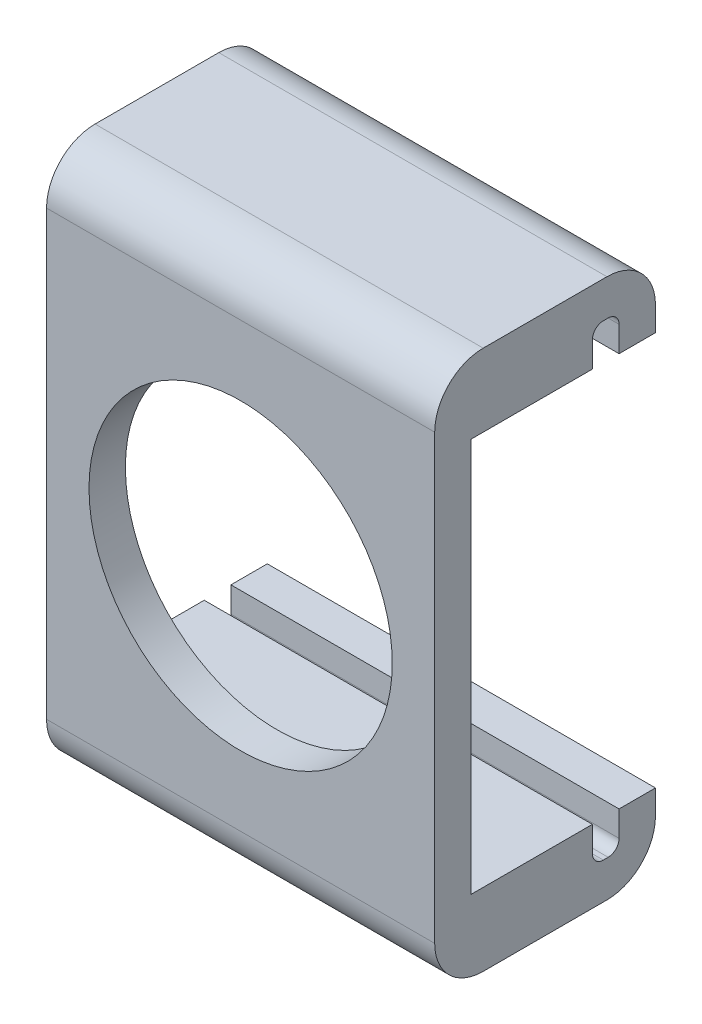
ISO-10303-21;
HEADER;
FILE_DESCRIPTION(('STEP AP214'),'2;1');
FILE_NAME('part.step','',(''),(''),'','','');
FILE_SCHEMA(('AUTOMOTIVE_DESIGN { 1 0 10303 214 1 1 1 1 }'));
ENDSEC;
DATA;
#1=APPLICATION_CONTEXT('core data for automotive mechanical design processes');
#2=APPLICATION_PROTOCOL_DEFINITION('international standard','automotive_design',2000,#1);
#3=PRODUCT_CONTEXT('',#1,'mechanical');
#4=PRODUCT('Part','Part','',(#3));
#5=PRODUCT_RELATED_PRODUCT_CATEGORY('part','',(#4));
#6=PRODUCT_DEFINITION_FORMATION('','',#4);
#7=PRODUCT_DEFINITION_CONTEXT('part definition',#1,'design');
#8=PRODUCT_DEFINITION('design','',#6,#7);
#9=PRODUCT_DEFINITION_SHAPE('','',#8);
#10=(LENGTH_UNIT() NAMED_UNIT(*) SI_UNIT(.MILLI.,.METRE.));
#11=(NAMED_UNIT(*) PLANE_ANGLE_UNIT() SI_UNIT($,.RADIAN.));
#12=(NAMED_UNIT(*) SI_UNIT($,.STERADIAN.) SOLID_ANGLE_UNIT());
#13=UNCERTAINTY_MEASURE_WITH_UNIT(LENGTH_MEASURE(1.E-05),#10,'distance_accuracy_value','');
#14=(GEOMETRIC_REPRESENTATION_CONTEXT(3) GLOBAL_UNCERTAINTY_ASSIGNED_CONTEXT((#13)) GLOBAL_UNIT_ASSIGNED_CONTEXT((#10,
#11,#12)) REPRESENTATION_CONTEXT('',''));
#15=CARTESIAN_POINT('',(0.,0.,0.));
#16=DIRECTION('',(0.,0.,1.));
#17=DIRECTION('',(1.,0.,0.));
#18=AXIS2_PLACEMENT_3D('',#15,#16,#17);
#19=CARTESIAN_POINT('',(0.,0.,3.));
#20=DIRECTION('',(1.,0.,0.));
#21=DIRECTION('',(0.,0.,-1.));
#22=AXIS2_PLACEMENT_3D('',#19,#20,#21);
#23=PLANE('',#22);
#24=DIRECTION('',(0.,1.,0.));
#25=VECTOR('',#24,1.);
#26=CARTESIAN_POINT('',(0.,0.,-15.2));
#27=LINE('',#26,#25);
#28=CARTESIAN_POINT('',(0.,4.,-15.2));
#29=VERTEX_POINT('',#28);
#30=CARTESIAN_POINT('',(0.,5.99999999999999,-15.2));
#31=VERTEX_POINT('',#30);
#32=EDGE_CURVE('E197',#29,#31,#27,.T.);
#33=ORIENTED_EDGE('',*,*,#32,.F.);
#34=CARTESIAN_POINT('',(0.,4.,-11.2));
#35=DIRECTION('',(1.,0.,0.));
#36=DIRECTION('',(0.,0.,-1.));
#37=AXIS2_PLACEMENT_3D('',#34,#35,#36);
#38=CIRCLE('',#37,4.);
#39=CARTESIAN_POINT('',(0.,0.,-11.2));
#40=VERTEX_POINT('',#39);
#41=EDGE_CURVE('E383',#29,#40,#38,.F.);
#42=ORIENTED_EDGE('',*,*,#41,.T.);
#43=DIRECTION('',(0.,0.,-1.));
#44=VECTOR('',#43,1.);
#45=CARTESIAN_POINT('',(0.,0.,3.));
#46=LINE('',#45,#44);
#47=CARTESIAN_POINT('',(0.,0.,-1.));
#48=VERTEX_POINT('',#47);
#49=EDGE_CURVE('E348',#48,#40,#46,.T.);
#50=ORIENTED_EDGE('',*,*,#49,.F.);
#51=CARTESIAN_POINT('',(0.,4.,-1.));
#52=DIRECTION('',(1.,0.,0.));
#53=DIRECTION('',(0.,0.,-1.));
#54=AXIS2_PLACEMENT_3D('',#51,#52,#53);
#55=CIRCLE('',#54,4.);
#56=CARTESIAN_POINT('',(0.,4.,3.));
#57=VERTEX_POINT('',#56);
#58=EDGE_CURVE('E370',#48,#57,#55,.F.);
#59=ORIENTED_EDGE('',*,*,#58,.T.);
#60=DIRECTION('',(0.,-1.,0.));
#61=VECTOR('',#60,1.);
#62=CARTESIAN_POINT('',(0.,0.,3.));
#63=LINE('',#62,#61);
#64=CARTESIAN_POINT('',(0.,40.5,3.));
#65=VERTEX_POINT('',#64);
#66=EDGE_CURVE('E331',#65,#57,#63,.T.);
#67=ORIENTED_EDGE('',*,*,#66,.F.);
#68=CARTESIAN_POINT('',(0.,40.5,-1.));
#69=DIRECTION('',(1.,0.,0.));
#70=DIRECTION('',(0.,0.,-1.));
#71=AXIS2_PLACEMENT_3D('',#68,#69,#70);
#72=CIRCLE('',#71,4.);
#73=CARTESIAN_POINT('',(0.,44.5,-1.));
#74=VERTEX_POINT('',#73);
#75=EDGE_CURVE('E368',#65,#74,#72,.F.);
#76=ORIENTED_EDGE('',*,*,#75,.T.);
#77=DIRECTION('',(0.,0.,-1.));
#78=VECTOR('',#77,1.);
#79=CARTESIAN_POINT('',(0.,44.5,3.));
#80=LINE('',#79,#78);
#81=CARTESIAN_POINT('',(0.,44.5,-11.2));
#82=VERTEX_POINT('',#81);
#83=EDGE_CURVE('E338',#74,#82,#80,.T.);
#84=ORIENTED_EDGE('',*,*,#83,.T.);
#85=CARTESIAN_POINT('',(0.,40.5,-11.2));
#86=DIRECTION('',(1.,0.,0.));
#87=DIRECTION('',(0.,0.,-1.));
#88=AXIS2_PLACEMENT_3D('',#85,#86,#87);
#89=CIRCLE('',#88,4.);
#90=CARTESIAN_POINT('',(0.,40.5,-15.2));
#91=VERTEX_POINT('',#90);
#92=EDGE_CURVE('E50',#82,#91,#89,.F.);
#93=ORIENTED_EDGE('',*,*,#92,.T.);
#94=DIRECTION('',(0.,1.,0.));
#95=VECTOR('',#94,1.);
#96=CARTESIAN_POINT('',(0.,44.5,-15.2));
#97=LINE('',#96,#95);
#98=CARTESIAN_POINT('',(0.,38.5,-15.2));
#99=VERTEX_POINT('',#98);
#100=EDGE_CURVE('E292',#99,#91,#97,.T.);
#101=ORIENTED_EDGE('',*,*,#100,.F.);
#102=DIRECTION('',(0.,0.,-1.));
#103=VECTOR('',#102,1.);
#104=CARTESIAN_POINT('',(0.,38.5,-15.2));
#105=LINE('',#104,#103);
#106=CARTESIAN_POINT('',(0.,38.5,-12.2));
#107=VERTEX_POINT('',#106);
#108=EDGE_CURVE('E289',#107,#99,#105,.T.);
#109=ORIENTED_EDGE('',*,*,#108,.F.);
#110=DIRECTION('',(0.,-1.,0.));
#111=VECTOR('',#110,1.);
#112=CARTESIAN_POINT('',(0.,38.5,-12.2));
#113=LINE('',#112,#111);
#114=CARTESIAN_POINT('',(0.,40.6,-12.2));
#115=VERTEX_POINT('',#114);
#116=EDGE_CURVE('E286',#115,#107,#113,.T.);
#117=ORIENTED_EDGE('',*,*,#116,.F.);
#118=CARTESIAN_POINT('',(0.,40.6,-11.3));
#119=DIRECTION('',(-1.,0.,0.));
#120=DIRECTION('',(0.,1.,0.));
#121=AXIS2_PLACEMENT_3D('',#118,#119,#120);
#122=CIRCLE('',#121,0.899999999999999);
#123=CARTESIAN_POINT('',(0.,41.5,-11.3));
#124=VERTEX_POINT('',#123);
#125=EDGE_CURVE('E283',#124,#115,#122,.T.);
#126=ORIENTED_EDGE('',*,*,#125,.F.);
#127=DIRECTION('',(0.,0.,-1.));
#128=VECTOR('',#127,1.);
#129=CARTESIAN_POINT('',(0.,41.5,-11.3));
#130=LINE('',#129,#128);
#131=CARTESIAN_POINT('',(0.,41.5,-10.9));
#132=VERTEX_POINT('',#131);
#133=EDGE_CURVE('E280',#132,#124,#130,.T.);
#134=ORIENTED_EDGE('',*,*,#133,.F.);
#135=CARTESIAN_POINT('',(0.,40.6,-10.9));
#136=DIRECTION('',(-1.,0.,0.));
#137=DIRECTION('',(0.,-1.,0.));
#138=AXIS2_PLACEMENT_3D('',#135,#136,#137);
#139=CIRCLE('',#138,0.899999999999999);
#140=CARTESIAN_POINT('',(0.,40.6,-10.));
#141=VERTEX_POINT('',#140);
#142=EDGE_CURVE('E277',#141,#132,#139,.T.);
#143=ORIENTED_EDGE('',*,*,#142,.F.);
#144=DIRECTION('',(0.,1.,0.));
#145=VECTOR('',#144,1.);
#146=CARTESIAN_POINT('',(0.,38.5,-10.));
#147=LINE('',#146,#145);
#148=CARTESIAN_POINT('',(0.,38.5,-10.));
#149=VERTEX_POINT('',#148);
#150=EDGE_CURVE('E273',#149,#141,#147,.T.);
#151=ORIENTED_EDGE('',*,*,#150,.F.);
#152=DIRECTION('',(0.,0.,-1.));
#153=VECTOR('',#152,1.);
#154=CARTESIAN_POINT('',(0.,38.5,3.));
#155=LINE('',#154,#153);
#156=CARTESIAN_POINT('',(0.,38.5,0.));
#157=VERTEX_POINT('',#156);
#158=EDGE_CURVE('E271',#157,#149,#155,.T.);
#159=ORIENTED_EDGE('',*,*,#158,.F.);
#160=DIRECTION('',(0.,-1.,0.));
#161=VECTOR('',#160,1.);
#162=CARTESIAN_POINT('',(0.,0.,0.));
#163=LINE('',#162,#161);
#164=CARTESIAN_POINT('',(0.,6.,0.));
#165=VERTEX_POINT('',#164);
#166=EDGE_CURVE('E318',#157,#165,#163,.T.);
#167=ORIENTED_EDGE('',*,*,#166,.T.);
#168=DIRECTION('',(0.,0.,1.));
#169=VECTOR('',#168,1.);
#170=CARTESIAN_POINT('',(0.,6.,3.));
#171=LINE('',#170,#169);
#172=CARTESIAN_POINT('',(0.,5.99999999999999,-10.));
#173=VERTEX_POINT('',#172);
#174=EDGE_CURVE('E216',#173,#165,#171,.T.);
#175=ORIENTED_EDGE('',*,*,#174,.F.);
#176=DIRECTION('',(0.,1.,0.));
#177=VECTOR('',#176,1.);
#178=CARTESIAN_POINT('',(0.,5.99999999999999,-10.));
#179=LINE('',#178,#177);
#180=CARTESIAN_POINT('',(0.,3.89999999999999,-10.));
#181=VERTEX_POINT('',#180);
#182=EDGE_CURVE('E235',#181,#173,#179,.T.);
#183=ORIENTED_EDGE('',*,*,#182,.F.);
#184=CARTESIAN_POINT('',(0.,3.89999999999999,-10.9));
#185=DIRECTION('',(-1.,0.,0.));
#186=DIRECTION('',(0.,1.,0.));
#187=AXIS2_PLACEMENT_3D('',#184,#185,#186);
#188=CIRCLE('',#187,0.899999999999999);
#189=CARTESIAN_POINT('',(0.,2.99999999999999,-10.9));
#190=VERTEX_POINT('',#189);
#191=EDGE_CURVE('E232',#190,#181,#188,.T.);
#192=ORIENTED_EDGE('',*,*,#191,.F.);
#193=DIRECTION('',(0.,0.,1.));
#194=VECTOR('',#193,1.);
#195=CARTESIAN_POINT('',(0.,2.99999999999999,-11.3));
#196=LINE('',#195,#194);
#197=CARTESIAN_POINT('',(0.,2.99999999999999,-11.3));
#198=VERTEX_POINT('',#197);
#199=EDGE_CURVE('E229',#198,#190,#196,.T.);
#200=ORIENTED_EDGE('',*,*,#199,.F.);
#201=CARTESIAN_POINT('',(0.,3.89999999999999,-11.3));
#202=DIRECTION('',(-1.,0.,0.));
#203=DIRECTION('',(0.,-1.,0.));
#204=AXIS2_PLACEMENT_3D('',#201,#202,#203);
#205=CIRCLE('',#204,0.899999999999999);
#206=CARTESIAN_POINT('',(0.,3.89999999999999,-12.2));
#207=VERTEX_POINT('',#206);
#208=EDGE_CURVE('E223',#207,#198,#205,.T.);
#209=ORIENTED_EDGE('',*,*,#208,.F.);
#210=DIRECTION('',(0.,-1.,0.));
#211=VECTOR('',#210,1.);
#212=CARTESIAN_POINT('',(0.,5.99999999999999,-12.2));
#213=LINE('',#212,#211);
#214=CARTESIAN_POINT('',(0.,5.99999999999999,-12.2));
#215=VERTEX_POINT('',#214);
#216=EDGE_CURVE('E221',#215,#207,#213,.T.);
#217=ORIENTED_EDGE('',*,*,#216,.F.);
#218=DIRECTION('',(0.,0.,1.));
#219=VECTOR('',#218,1.);
#220=CARTESIAN_POINT('',(0.,5.99999999999999,-15.2));
#221=LINE('',#220,#219);
#222=EDGE_CURVE('E207',#31,#215,#221,.T.);
#223=ORIENTED_EDGE('',*,*,#222,.F.);
#224=EDGE_LOOP('',(#33,#42,#50,#59,#67,#76,#84,#93,#101,#109,#117,#126,#134,#143,#151,#159,#167,
#175,#183,#192,#200,#209,#217,#223));
#225=FACE_BOUND('',#224,.T.);
#226=ADVANCED_FACE('F35',(#225),#23,.F.);
#227=CARTESIAN_POINT('',(0.,0.,3.));
#228=DIRECTION('',(0.,1.,0.));
#229=DIRECTION('',(0.,0.,1.));
#230=AXIS2_PLACEMENT_3D('',#227,#228,#229);
#231=PLANE('',#230);
#232=ORIENTED_EDGE('',*,*,#49,.T.);
#233=DIRECTION('',(1.,0.,0.));
#234=VECTOR('',#233,1.);
#235=CARTESIAN_POINT('',(32.,0.,-11.2));
#236=LINE('',#235,#234);
#237=CARTESIAN_POINT('',(32.,0.,-11.2));
#238=VERTEX_POINT('',#237);
#239=EDGE_CURVE('E374',#40,#238,#236,.T.);
#240=ORIENTED_EDGE('',*,*,#239,.T.);
#241=DIRECTION('',(0.,0.,-1.));
#242=VECTOR('',#241,1.);
#243=CARTESIAN_POINT('',(32.,0.,3.));
#244=LINE('',#243,#242);
#245=CARTESIAN_POINT('',(32.,0.,-1.));
#246=VERTEX_POINT('',#245);
#247=EDGE_CURVE('E345',#246,#238,#244,.T.);
#248=ORIENTED_EDGE('',*,*,#247,.F.);
#249=DIRECTION('',(1.,0.,0.));
#250=VECTOR('',#249,1.);
#251=CARTESIAN_POINT('',(0.,0.,-1.));
#252=LINE('',#251,#250);
#253=EDGE_CURVE('E366',#246,#48,#252,.F.);
#254=ORIENTED_EDGE('',*,*,#253,.T.);
#255=EDGE_LOOP('',(#232,#240,#248,#254));
#256=FACE_BOUND('',#255,.T.);
#257=ADVANCED_FACE('F456',(#256),#231,.F.);
#258=CARTESIAN_POINT('',(32.,0.,3.));
#259=DIRECTION('',(-1.,0.,0.));
#260=DIRECTION('',(0.,-1.,0.));
#261=AXIS2_PLACEMENT_3D('',#258,#259,#260);
#262=PLANE('',#261);
#263=ORIENTED_EDGE('',*,*,#247,.T.);
#264=CARTESIAN_POINT('',(32.,4.,-11.2));
#265=DIRECTION('',(-1.,0.,0.));
#266=DIRECTION('',(0.,-1.,0.));
#267=AXIS2_PLACEMENT_3D('',#264,#265,#266);
#268=CIRCLE('',#267,4.);
#269=CARTESIAN_POINT('',(32.,4.,-15.2));
#270=VERTEX_POINT('',#269);
#271=EDGE_CURVE('E379',#238,#270,#268,.F.);
#272=ORIENTED_EDGE('',*,*,#271,.T.);
#273=DIRECTION('',(0.,1.,0.));
#274=VECTOR('',#273,1.);
#275=CARTESIAN_POINT('',(32.,0.,-15.2));
#276=LINE('',#275,#274);
#277=CARTESIAN_POINT('',(32.,6.,-15.2));
#278=VERTEX_POINT('',#277);
#279=EDGE_CURVE('E239',#270,#278,#276,.T.);
#280=ORIENTED_EDGE('',*,*,#279,.T.);
#281=DIRECTION('',(0.,0.,1.));
#282=VECTOR('',#281,1.);
#283=CARTESIAN_POINT('',(32.,6.,-15.2));
#284=LINE('',#283,#282);
#285=CARTESIAN_POINT('',(32.,6.,-12.2));
#286=VERTEX_POINT('',#285);
#287=EDGE_CURVE('E214',#278,#286,#284,.T.);
#288=ORIENTED_EDGE('',*,*,#287,.T.);
#289=DIRECTION('',(0.,-1.,0.));
#290=VECTOR('',#289,1.);
#291=CARTESIAN_POINT('',(32.,6.,-12.2));
#292=LINE('',#291,#290);
#293=CARTESIAN_POINT('',(32.,3.89999999999999,-12.2));
#294=VERTEX_POINT('',#293);
#295=EDGE_CURVE('E243',#286,#294,#292,.T.);
#296=ORIENTED_EDGE('',*,*,#295,.T.);
#297=CARTESIAN_POINT('',(32.,3.89999999999999,-11.3));
#298=DIRECTION('',(-1.,0.,0.));
#299=DIRECTION('',(0.,-1.,0.));
#300=AXIS2_PLACEMENT_3D('',#297,#298,#299);
#301=CIRCLE('',#300,0.899999999999999);
#302=CARTESIAN_POINT('',(32.,2.99999999999999,-11.3));
#303=VERTEX_POINT('',#302);
#304=EDGE_CURVE('E246',#294,#303,#301,.T.);
#305=ORIENTED_EDGE('',*,*,#304,.T.);
#306=DIRECTION('',(0.,0.,1.));
#307=VECTOR('',#306,1.);
#308=CARTESIAN_POINT('',(32.,2.99999999999999,-11.3));
#309=LINE('',#308,#307);
#310=CARTESIAN_POINT('',(32.,2.99999999999999,-10.9));
#311=VERTEX_POINT('',#310);
#312=EDGE_CURVE('E249',#303,#311,#309,.T.);
#313=ORIENTED_EDGE('',*,*,#312,.T.);
#314=CARTESIAN_POINT('',(32.,3.89999999999999,-10.9));
#315=DIRECTION('',(-1.,0.,0.));
#316=DIRECTION('',(0.,1.,0.));
#317=AXIS2_PLACEMENT_3D('',#314,#315,#316);
#318=CIRCLE('',#317,0.899999999999999);
#319=CARTESIAN_POINT('',(32.,3.89999999999999,-10.));
#320=VERTEX_POINT('',#319);
#321=EDGE_CURVE('E252',#311,#320,#318,.T.);
#322=ORIENTED_EDGE('',*,*,#321,.T.);
#323=DIRECTION('',(0.,1.,0.));
#324=VECTOR('',#323,1.);
#325=CARTESIAN_POINT('',(32.,6.,-10.));
#326=LINE('',#325,#324);
#327=CARTESIAN_POINT('',(32.,6.,-10.));
#328=VERTEX_POINT('',#327);
#329=EDGE_CURVE('E255',#320,#328,#326,.T.);
#330=ORIENTED_EDGE('',*,*,#329,.T.);
#331=DIRECTION('',(0.,0.,1.));
#332=VECTOR('',#331,1.);
#333=CARTESIAN_POINT('',(32.,6.,3.));
#334=LINE('',#333,#332);
#335=CARTESIAN_POINT('',(32.,6.,0.));
#336=VERTEX_POINT('',#335);
#337=EDGE_CURVE('E208',#328,#336,#334,.T.);
#338=ORIENTED_EDGE('',*,*,#337,.T.);
#339=DIRECTION('',(0.,1.,0.));
#340=VECTOR('',#339,1.);
#341=CARTESIAN_POINT('',(32.,0.,0.));
#342=LINE('',#341,#340);
#343=CARTESIAN_POINT('',(32.,38.5,0.));
#344=VERTEX_POINT('',#343);
#345=EDGE_CURVE('E335',#336,#344,#342,.T.);
#346=ORIENTED_EDGE('',*,*,#345,.T.);
#347=DIRECTION('',(0.,0.,-1.));
#348=VECTOR('',#347,1.);
#349=CARTESIAN_POINT('',(32.,38.5,3.));
#350=LINE('',#349,#348);
#351=CARTESIAN_POINT('',(32.,38.5,-10.));
#352=VERTEX_POINT('',#351);
#353=EDGE_CURVE('E261',#344,#352,#350,.T.);
#354=ORIENTED_EDGE('',*,*,#353,.T.);
#355=DIRECTION('',(0.,1.,0.));
#356=VECTOR('',#355,1.);
#357=CARTESIAN_POINT('',(32.,38.5,-10.));
#358=LINE('',#357,#356);
#359=CARTESIAN_POINT('',(32.,40.6,-10.));
#360=VERTEX_POINT('',#359);
#361=EDGE_CURVE('E296',#352,#360,#358,.T.);
#362=ORIENTED_EDGE('',*,*,#361,.T.);
#363=CARTESIAN_POINT('',(32.,40.6,-10.9));
#364=DIRECTION('',(-1.,0.,0.));
#365=DIRECTION('',(0.,-1.,0.));
#366=AXIS2_PLACEMENT_3D('',#363,#364,#365);
#367=CIRCLE('',#366,0.899999999999999);
#368=CARTESIAN_POINT('',(32.,41.5,-10.9));
#369=VERTEX_POINT('',#368);
#370=EDGE_CURVE('E299',#360,#369,#367,.T.);
#371=ORIENTED_EDGE('',*,*,#370,.T.);
#372=DIRECTION('',(0.,0.,-1.));
#373=VECTOR('',#372,1.);
#374=CARTESIAN_POINT('',(32.,41.5,-11.3));
#375=LINE('',#374,#373);
#376=CARTESIAN_POINT('',(32.,41.5,-11.3));
#377=VERTEX_POINT('',#376);
#378=EDGE_CURVE('E302',#369,#377,#375,.T.);
#379=ORIENTED_EDGE('',*,*,#378,.T.);
#380=CARTESIAN_POINT('',(32.,40.6,-11.3));
#381=DIRECTION('',(-1.,0.,0.));
#382=DIRECTION('',(0.,1.,0.));
#383=AXIS2_PLACEMENT_3D('',#380,#381,#382);
#384=CIRCLE('',#383,0.899999999999999);
#385=CARTESIAN_POINT('',(32.,40.6,-12.2));
#386=VERTEX_POINT('',#385);
#387=EDGE_CURVE('E305',#377,#386,#384,.T.);
#388=ORIENTED_EDGE('',*,*,#387,.T.);
#389=DIRECTION('',(0.,-1.,0.));
#390=VECTOR('',#389,1.);
#391=CARTESIAN_POINT('',(32.,38.5,-12.2));
#392=LINE('',#391,#390);
#393=CARTESIAN_POINT('',(32.,38.5,-12.2));
#394=VERTEX_POINT('',#393);
#395=EDGE_CURVE('E308',#386,#394,#392,.T.);
#396=ORIENTED_EDGE('',*,*,#395,.T.);
#397=DIRECTION('',(0.,0.,-1.));
#398=VECTOR('',#397,1.);
#399=CARTESIAN_POINT('',(32.,38.5,-15.2));
#400=LINE('',#399,#398);
#401=CARTESIAN_POINT('',(32.,38.5,-15.2));
#402=VERTEX_POINT('',#401);
#403=EDGE_CURVE('E311',#394,#402,#400,.T.);
#404=ORIENTED_EDGE('',*,*,#403,.T.);
#405=DIRECTION('',(0.,1.,0.));
#406=VECTOR('',#405,1.);
#407=CARTESIAN_POINT('',(32.,44.5,-15.2));
#408=LINE('',#407,#406);
#409=CARTESIAN_POINT('',(32.,40.5,-15.2));
#410=VERTEX_POINT('',#409);
#411=EDGE_CURVE('E274',#402,#410,#408,.T.);
#412=ORIENTED_EDGE('',*,*,#411,.T.);
#413=CARTESIAN_POINT('',(32.,40.5,-11.2));
#414=DIRECTION('',(-1.,0.,0.));
#415=DIRECTION('',(0.,-1.,0.));
#416=AXIS2_PLACEMENT_3D('',#413,#414,#415);
#417=CIRCLE('',#416,4.);
#418=CARTESIAN_POINT('',(32.,44.5,-11.2));
#419=VERTEX_POINT('',#418);
#420=EDGE_CURVE('E377',#410,#419,#417,.F.);
#421=ORIENTED_EDGE('',*,*,#420,.T.);
#422=DIRECTION('',(0.,0.,-1.));
#423=VECTOR('',#422,1.);
#424=CARTESIAN_POINT('',(32.,44.5,3.));
#425=LINE('',#424,#423);
#426=CARTESIAN_POINT('',(32.,44.5,-1.));
#427=VERTEX_POINT('',#426);
#428=EDGE_CURVE('E343',#427,#419,#425,.T.);
#429=ORIENTED_EDGE('',*,*,#428,.F.);
#430=CARTESIAN_POINT('',(32.,40.5,-1.));
#431=DIRECTION('',(-1.,0.,0.));
#432=DIRECTION('',(0.,-1.,0.));
#433=AXIS2_PLACEMENT_3D('',#430,#431,#432);
#434=CIRCLE('',#433,4.);
#435=CARTESIAN_POINT('',(32.,40.5,3.));
#436=VERTEX_POINT('',#435);
#437=EDGE_CURVE('E362',#427,#436,#434,.F.);
#438=ORIENTED_EDGE('',*,*,#437,.T.);
#439=DIRECTION('',(0.,1.,0.));
#440=VECTOR('',#439,1.);
#441=CARTESIAN_POINT('',(32.,0.,3.));
#442=LINE('',#441,#440);
#443=CARTESIAN_POINT('',(32.,4.,3.));
#444=VERTEX_POINT('',#443);
#445=EDGE_CURVE('E334',#444,#436,#442,.T.);
#446=ORIENTED_EDGE('',*,*,#445,.F.);
#447=CARTESIAN_POINT('',(32.,4.,-1.));
#448=DIRECTION('',(-1.,0.,0.));
#449=DIRECTION('',(0.,-1.,0.));
#450=AXIS2_PLACEMENT_3D('',#447,#448,#449);
#451=CIRCLE('',#450,4.);
#452=EDGE_CURVE('E364',#444,#246,#451,.F.);
#453=ORIENTED_EDGE('',*,*,#452,.T.);
#454=EDGE_LOOP('',(#263,#272,#280,#288,#296,#305,#313,#322,#330,#338,#346,#354,#362,#371,#379,
#388,#396,#404,#412,#421,#429,#438,#446,#453));
#455=FACE_BOUND('',#454,.T.);
#456=ADVANCED_FACE('F391',(#455),#262,.F.);
#457=CARTESIAN_POINT('',(0.,44.5,3.));
#458=DIRECTION('',(0.,-1.,0.));
#459=DIRECTION('',(0.,0.,-1.));
#460=AXIS2_PLACEMENT_3D('',#457,#458,#459);
#461=PLANE('',#460);
#462=ORIENTED_EDGE('',*,*,#428,.T.);
#463=DIRECTION('',(1.,0.,0.));
#464=VECTOR('',#463,1.);
#465=CARTESIAN_POINT('',(0.,44.5,-11.2));
#466=LINE('',#465,#464);
#467=EDGE_CURVE('E11',#419,#82,#466,.F.);
#468=ORIENTED_EDGE('',*,*,#467,.T.);
#469=ORIENTED_EDGE('',*,*,#83,.F.);
#470=DIRECTION('',(-1.,0.,0.));
#471=VECTOR('',#470,1.);
#472=CARTESIAN_POINT('',(0.,44.5,-1.));
#473=LINE('',#472,#471);
#474=EDGE_CURVE('E372',#74,#427,#473,.F.);
#475=ORIENTED_EDGE('',*,*,#474,.T.);
#476=EDGE_LOOP('',(#462,#468,#469,#475));
#477=FACE_BOUND('',#476,.T.);
#478=ADVANCED_FACE('F471',(#477),#461,.F.);
#479=CARTESIAN_POINT('',(0.,0.,3.));
#480=DIRECTION('',(0.,0.,-1.));
#481=DIRECTION('',(-1.,0.,0.));
#482=AXIS2_PLACEMENT_3D('',#479,#480,#481);
#483=PLANE('',#482);
#484=CARTESIAN_POINT('',(16.,22.25,3.));
#485=DIRECTION('',(0.,0.,-1.));
#486=DIRECTION('',(-1.,0.,0.));
#487=AXIS2_PLACEMENT_3D('',#484,#485,#486);
#488=CIRCLE('',#487,12.5);
#489=CARTESIAN_POINT('',(3.5,22.25,3.));
#490=VERTEX_POINT('',#489);
#491=EDGE_CURVE('E241',#490,#490,#488,.T.);
#492=ORIENTED_EDGE('',*,*,#491,.T.);
#493=EDGE_LOOP('',(#492));
#494=FACE_BOUND('',#493,.T.);
#495=ORIENTED_EDGE('',*,*,#66,.T.);
#496=DIRECTION('',(1.,0.,0.));
#497=VECTOR('',#496,1.);
#498=CARTESIAN_POINT('',(0.,4.,3.));
#499=LINE('',#498,#497);
#500=EDGE_CURVE('E359',#57,#444,#499,.T.);
#501=ORIENTED_EDGE('',*,*,#500,.T.);
#502=ORIENTED_EDGE('',*,*,#445,.T.);
#503=DIRECTION('',(-1.,0.,0.));
#504=VECTOR('',#503,1.);
#505=CARTESIAN_POINT('',(0.,40.5,3.));
#506=LINE('',#505,#504);
#507=EDGE_CURVE('E356',#436,#65,#506,.T.);
#508=ORIENTED_EDGE('',*,*,#507,.T.);
#509=EDGE_LOOP('',(#495,#501,#502,#508));
#510=FACE_BOUND('',#509,.T.);
#511=ADVANCED_FACE('F464',(#494,#510),#483,.F.);
#512=CARTESIAN_POINT('',(0.,0.,0.));
#513=DIRECTION('',(0.,0.,-1.));
#514=DIRECTION('',(-1.,0.,0.));
#515=AXIS2_PLACEMENT_3D('',#512,#513,#514);
#516=PLANE('',#515);
#517=CARTESIAN_POINT('',(16.,22.25,0.));
#518=DIRECTION('',(0.,0.,-1.));
#519=DIRECTION('',(-1.,0.,0.));
#520=AXIS2_PLACEMENT_3D('',#517,#518,#519);
#521=CIRCLE('',#520,12.5);
#522=CARTESIAN_POINT('',(3.5,22.25,0.));
#523=VERTEX_POINT('',#522);
#524=EDGE_CURVE('E718',#523,#523,#521,.T.);
#525=ORIENTED_EDGE('',*,*,#524,.F.);
#526=EDGE_LOOP('',(#525));
#527=FACE_BOUND('',#526,.T.);
#528=DIRECTION('',(1.,0.,0.));
#529=VECTOR('',#528,1.);
#530=CARTESIAN_POINT('',(0.,6.,0.));
#531=LINE('',#530,#529);
#532=EDGE_CURVE('E353',#165,#336,#531,.T.);
#533=ORIENTED_EDGE('',*,*,#532,.F.);
#534=ORIENTED_EDGE('',*,*,#166,.F.);
#535=DIRECTION('',(-1.,0.,0.));
#536=VECTOR('',#535,1.);
#537=CARTESIAN_POINT('',(0.,38.5,0.));
#538=LINE('',#537,#536);
#539=EDGE_CURVE('E351',#344,#157,#538,.T.);
#540=ORIENTED_EDGE('',*,*,#539,.F.);
#541=ORIENTED_EDGE('',*,*,#345,.F.);
#542=EDGE_LOOP('',(#533,#534,#540,#541));
#543=FACE_BOUND('',#542,.T.);
#544=ADVANCED_FACE('F427',(#527,#543),#516,.T.);
#545=CARTESIAN_POINT('',(0.,44.5,-15.2));
#546=DIRECTION('',(0.,0.,-1.));
#547=DIRECTION('',(-1.,0.,0.));
#548=AXIS2_PLACEMENT_3D('',#545,#546,#547);
#549=PLANE('',#548);
#550=ORIENTED_EDGE('',*,*,#100,.T.);
#551=DIRECTION('',(1.,0.,0.));
#552=VECTOR('',#551,1.);
#553=CARTESIAN_POINT('',(32.,40.5,-15.2));
#554=LINE('',#553,#552);
#555=EDGE_CURVE('E43',#91,#410,#554,.T.);
#556=ORIENTED_EDGE('',*,*,#555,.T.);
#557=ORIENTED_EDGE('',*,*,#411,.F.);
#558=DIRECTION('',(1.,0.,0.));
#559=VECTOR('',#558,1.);
#560=CARTESIAN_POINT('',(0.,38.5,-15.2));
#561=LINE('',#560,#559);
#562=EDGE_CURVE('E316',#99,#402,#561,.T.);
#563=ORIENTED_EDGE('',*,*,#562,.F.);
#564=EDGE_LOOP('',(#550,#556,#557,#563));
#565=FACE_BOUND('',#564,.T.);
#566=ADVANCED_FACE('F388',(#565),#549,.T.);
#567=CARTESIAN_POINT('',(0.,38.5,-15.2));
#568=DIRECTION('',(0.,-1.,0.));
#569=DIRECTION('',(1.,0.,0.));
#570=AXIS2_PLACEMENT_3D('',#567,#568,#569);
#571=PLANE('',#570);
#572=ORIENTED_EDGE('',*,*,#403,.F.);
#573=DIRECTION('',(1.,0.,0.));
#574=VECTOR('',#573,1.);
#575=CARTESIAN_POINT('',(0.,38.5,-12.2));
#576=LINE('',#575,#574);
#577=EDGE_CURVE('E319',#107,#394,#576,.T.);
#578=ORIENTED_EDGE('',*,*,#577,.F.);
#579=ORIENTED_EDGE('',*,*,#108,.T.);
#580=ORIENTED_EDGE('',*,*,#562,.T.);
#581=EDGE_LOOP('',(#572,#578,#579,#580));
#582=FACE_BOUND('',#581,.T.);
#583=ADVANCED_FACE('F396',(#582),#571,.T.);
#584=CARTESIAN_POINT('',(0.,38.5,-12.2));
#585=DIRECTION('',(0.,0.,1.));
#586=DIRECTION('',(1.,0.,0.));
#587=AXIS2_PLACEMENT_3D('',#584,#585,#586);
#588=PLANE('',#587);
#589=ORIENTED_EDGE('',*,*,#395,.F.);
#590=DIRECTION('',(1.,0.,0.));
#591=VECTOR('',#590,1.);
#592=CARTESIAN_POINT('',(0.,40.6,-12.2));
#593=LINE('',#592,#591);
#594=EDGE_CURVE('E321',#115,#386,#593,.T.);
#595=ORIENTED_EDGE('',*,*,#594,.F.);
#596=ORIENTED_EDGE('',*,*,#116,.T.);
#597=ORIENTED_EDGE('',*,*,#577,.T.);
#598=EDGE_LOOP('',(#589,#595,#596,#597));
#599=FACE_BOUND('',#598,.T.);
#600=ADVANCED_FACE('F401',(#599),#588,.T.);
#601=CARTESIAN_POINT('',(0.,40.6,-11.3));
#602=DIRECTION('',(1.,0.,0.));
#603=DIRECTION('',(0.,1.,0.));
#604=AXIS2_PLACEMENT_3D('',#601,#602,#603);
#605=CYLINDRICAL_SURFACE('',#604,0.899999999999999);
#606=ORIENTED_EDGE('',*,*,#387,.F.);
#607=DIRECTION('',(1.,0.,0.));
#608=VECTOR('',#607,1.);
#609=CARTESIAN_POINT('',(0.,41.5,-11.3));
#610=LINE('',#609,#608);
#611=EDGE_CURVE('E323',#124,#377,#610,.T.);
#612=ORIENTED_EDGE('',*,*,#611,.F.);
#613=ORIENTED_EDGE('',*,*,#125,.T.);
#614=ORIENTED_EDGE('',*,*,#594,.T.);
#615=EDGE_LOOP('',(#606,#612,#613,#614));
#616=FACE_BOUND('',#615,.T.);
#617=ADVANCED_FACE('F404',(#616),#605,.F.);
#618=CARTESIAN_POINT('',(0.,41.5,-11.3));
#619=DIRECTION('',(0.,-1.,0.));
#620=DIRECTION('',(1.,0.,0.));
#621=AXIS2_PLACEMENT_3D('',#618,#619,#620);
#622=PLANE('',#621);
#623=ORIENTED_EDGE('',*,*,#378,.F.);
#624=DIRECTION('',(1.,0.,0.));
#625=VECTOR('',#624,1.);
#626=CARTESIAN_POINT('',(0.,41.5,-10.9));
#627=LINE('',#626,#625);
#628=EDGE_CURVE('E325',#132,#369,#627,.T.);
#629=ORIENTED_EDGE('',*,*,#628,.F.);
#630=ORIENTED_EDGE('',*,*,#133,.T.);
#631=ORIENTED_EDGE('',*,*,#611,.T.);
#632=EDGE_LOOP('',(#623,#629,#630,#631));
#633=FACE_BOUND('',#632,.T.);
#634=ADVANCED_FACE('F409',(#633),#622,.T.);
#635=CARTESIAN_POINT('',(0.,40.6,-10.9));
#636=DIRECTION('',(1.,0.,0.));
#637=DIRECTION('',(0.,1.,0.));
#638=AXIS2_PLACEMENT_3D('',#635,#636,#637);
#639=CYLINDRICAL_SURFACE('',#638,0.899999999999999);
#640=ORIENTED_EDGE('',*,*,#370,.F.);
#641=DIRECTION('',(1.,0.,0.));
#642=VECTOR('',#641,1.);
#643=CARTESIAN_POINT('',(0.,40.6,-10.));
#644=LINE('',#643,#642);
#645=EDGE_CURVE('E327',#141,#360,#644,.T.);
#646=ORIENTED_EDGE('',*,*,#645,.F.);
#647=ORIENTED_EDGE('',*,*,#142,.T.);
#648=ORIENTED_EDGE('',*,*,#628,.T.);
#649=EDGE_LOOP('',(#640,#646,#647,#648));
#650=FACE_BOUND('',#649,.T.);
#651=ADVANCED_FACE('F412',(#650),#639,.F.);
#652=CARTESIAN_POINT('',(0.,38.5,-10.));
#653=DIRECTION('',(0.,0.,-1.));
#654=DIRECTION('',(-1.,0.,0.));
#655=AXIS2_PLACEMENT_3D('',#652,#653,#654);
#656=PLANE('',#655);
#657=ORIENTED_EDGE('',*,*,#361,.F.);
#658=DIRECTION('',(1.,0.,0.));
#659=VECTOR('',#658,1.);
#660=CARTESIAN_POINT('',(0.,38.5,-10.));
#661=LINE('',#660,#659);
#662=EDGE_CURVE('E294',#149,#352,#661,.T.);
#663=ORIENTED_EDGE('',*,*,#662,.F.);
#664=ORIENTED_EDGE('',*,*,#150,.T.);
#665=ORIENTED_EDGE('',*,*,#645,.T.);
#666=EDGE_LOOP('',(#657,#663,#664,#665));
#667=FACE_BOUND('',#666,.T.);
#668=ADVANCED_FACE('F418',(#667),#656,.T.);
#669=CARTESIAN_POINT('',(0.,38.5,3.));
#670=DIRECTION('',(0.,-1.,0.));
#671=DIRECTION('',(1.,0.,0.));
#672=AXIS2_PLACEMENT_3D('',#669,#670,#671);
#673=PLANE('',#672);
#674=ORIENTED_EDGE('',*,*,#353,.F.);
#675=ORIENTED_EDGE('',*,*,#539,.T.);
#676=ORIENTED_EDGE('',*,*,#158,.T.);
#677=ORIENTED_EDGE('',*,*,#662,.T.);
#678=EDGE_LOOP('',(#674,#675,#676,#677));
#679=FACE_BOUND('',#678,.T.);
#680=ADVANCED_FACE('F421',(#679),#673,.T.);
#681=CARTESIAN_POINT('',(0.,6.,3.));
#682=DIRECTION('',(0.,1.,0.));
#683=DIRECTION('',(0.,0.,1.));
#684=AXIS2_PLACEMENT_3D('',#681,#682,#683);
#685=PLANE('',#684);
#686=ORIENTED_EDGE('',*,*,#174,.T.);
#687=ORIENTED_EDGE('',*,*,#532,.T.);
#688=ORIENTED_EDGE('',*,*,#337,.F.);
#689=DIRECTION('',(1.,0.,0.));
#690=VECTOR('',#689,1.);
#691=CARTESIAN_POINT('',(0.,5.99999999999999,-10.));
#692=LINE('',#691,#690);
#693=EDGE_CURVE('E259',#173,#328,#692,.T.);
#694=ORIENTED_EDGE('',*,*,#693,.F.);
#695=EDGE_LOOP('',(#686,#687,#688,#694));
#696=FACE_BOUND('',#695,.T.);
#697=ADVANCED_FACE('F431',(#696),#685,.T.);
#698=CARTESIAN_POINT('',(0.,5.99999999999999,-10.));
#699=DIRECTION('',(0.,0.,-1.));
#700=DIRECTION('',(-1.,0.,0.));
#701=AXIS2_PLACEMENT_3D('',#698,#699,#700);
#702=PLANE('',#701);
#703=ORIENTED_EDGE('',*,*,#329,.F.);
#704=DIRECTION('',(1.,0.,0.));
#705=VECTOR('',#704,1.);
#706=CARTESIAN_POINT('',(0.,3.89999999999999,-10.));
#707=LINE('',#706,#705);
#708=EDGE_CURVE('E262',#181,#320,#707,.T.);
#709=ORIENTED_EDGE('',*,*,#708,.F.);
#710=ORIENTED_EDGE('',*,*,#182,.T.);
#711=ORIENTED_EDGE('',*,*,#693,.T.);
#712=EDGE_LOOP('',(#703,#709,#710,#711));
#713=FACE_BOUND('',#712,.T.);
#714=ADVANCED_FACE('F436',(#713),#702,.T.);
#715=CARTESIAN_POINT('',(0.,3.89999999999999,-10.9));
#716=DIRECTION('',(1.,0.,0.));
#717=DIRECTION('',(0.,1.,0.));
#718=AXIS2_PLACEMENT_3D('',#715,#716,#717);
#719=CYLINDRICAL_SURFACE('',#718,0.899999999999999);
#720=ORIENTED_EDGE('',*,*,#321,.F.);
#721=DIRECTION('',(1.,0.,0.));
#722=VECTOR('',#721,1.);
#723=CARTESIAN_POINT('',(0.,2.99999999999999,-10.9));
#724=LINE('',#723,#722);
#725=EDGE_CURVE('E264',#190,#311,#724,.T.);
#726=ORIENTED_EDGE('',*,*,#725,.F.);
#727=ORIENTED_EDGE('',*,*,#191,.T.);
#728=ORIENTED_EDGE('',*,*,#708,.T.);
#729=EDGE_LOOP('',(#720,#726,#727,#728));
#730=FACE_BOUND('',#729,.T.);
#731=ADVANCED_FACE('F439',(#730),#719,.F.);
#732=CARTESIAN_POINT('',(0.,2.99999999999999,-11.3));
#733=DIRECTION('',(0.,1.,0.));
#734=DIRECTION('',(-1.,0.,0.));
#735=AXIS2_PLACEMENT_3D('',#732,#733,#734);
#736=PLANE('',#735);
#737=ORIENTED_EDGE('',*,*,#312,.F.);
#738=DIRECTION('',(1.,0.,0.));
#739=VECTOR('',#738,1.);
#740=CARTESIAN_POINT('',(0.,2.99999999999999,-11.3));
#741=LINE('',#740,#739);
#742=EDGE_CURVE('E266',#198,#303,#741,.T.);
#743=ORIENTED_EDGE('',*,*,#742,.F.);
#744=ORIENTED_EDGE('',*,*,#199,.T.);
#745=ORIENTED_EDGE('',*,*,#725,.T.);
#746=EDGE_LOOP('',(#737,#743,#744,#745));
#747=FACE_BOUND('',#746,.T.);
#748=ADVANCED_FACE('F443',(#747),#736,.T.);
#749=CARTESIAN_POINT('',(0.,3.89999999999999,-11.3));
#750=DIRECTION('',(1.,0.,0.));
#751=DIRECTION('',(0.,1.,0.));
#752=AXIS2_PLACEMENT_3D('',#749,#750,#751);
#753=CYLINDRICAL_SURFACE('',#752,0.899999999999999);
#754=ORIENTED_EDGE('',*,*,#304,.F.);
#755=DIRECTION('',(1.,0.,0.));
#756=VECTOR('',#755,1.);
#757=CARTESIAN_POINT('',(0.,3.89999999999999,-12.2));
#758=LINE('',#757,#756);
#759=EDGE_CURVE('E268',#207,#294,#758,.T.);
#760=ORIENTED_EDGE('',*,*,#759,.F.);
#761=ORIENTED_EDGE('',*,*,#208,.T.);
#762=ORIENTED_EDGE('',*,*,#742,.T.);
#763=EDGE_LOOP('',(#754,#760,#761,#762));
#764=FACE_BOUND('',#763,.T.);
#765=ADVANCED_FACE('F446',(#764),#753,.F.);
#766=CARTESIAN_POINT('',(0.,5.99999999999999,-12.2));
#767=DIRECTION('',(0.,0.,1.));
#768=DIRECTION('',(1.,0.,0.));
#769=AXIS2_PLACEMENT_3D('',#766,#767,#768);
#770=PLANE('',#769);
#771=ORIENTED_EDGE('',*,*,#295,.F.);
#772=DIRECTION('',(1.,0.,0.));
#773=VECTOR('',#772,1.);
#774=CARTESIAN_POINT('',(0.,5.99999999999999,-12.2));
#775=LINE('',#774,#773);
#776=EDGE_CURVE('E215',#215,#286,#775,.T.);
#777=ORIENTED_EDGE('',*,*,#776,.F.);
#778=ORIENTED_EDGE('',*,*,#216,.T.);
#779=ORIENTED_EDGE('',*,*,#759,.T.);
#780=EDGE_LOOP('',(#771,#777,#778,#779));
#781=FACE_BOUND('',#780,.T.);
#782=ADVANCED_FACE('F449',(#781),#770,.T.);
#783=CARTESIAN_POINT('',(0.,5.99999999999999,-15.2));
#784=DIRECTION('',(0.,1.,0.));
#785=DIRECTION('',(-1.,0.,0.));
#786=AXIS2_PLACEMENT_3D('',#783,#784,#785);
#787=PLANE('',#786);
#788=ORIENTED_EDGE('',*,*,#287,.F.);
#789=DIRECTION('',(1.,0.,0.));
#790=VECTOR('',#789,1.);
#791=CARTESIAN_POINT('',(0.,5.99999999999999,-15.2));
#792=LINE('',#791,#790);
#793=EDGE_CURVE('E201',#31,#278,#792,.T.);
#794=ORIENTED_EDGE('',*,*,#793,.F.);
#795=ORIENTED_EDGE('',*,*,#222,.T.);
#796=ORIENTED_EDGE('',*,*,#776,.T.);
#797=EDGE_LOOP('',(#788,#794,#795,#796));
#798=FACE_BOUND('',#797,.T.);
#799=ADVANCED_FACE('F212',(#798),#787,.T.);
#800=CARTESIAN_POINT('',(0.,0.,-15.2));
#801=DIRECTION('',(0.,0.,-1.));
#802=DIRECTION('',(-1.,0.,0.));
#803=AXIS2_PLACEMENT_3D('',#800,#801,#802);
#804=PLANE('',#803);
#805=ORIENTED_EDGE('',*,*,#279,.F.);
#806=DIRECTION('',(1.,0.,0.));
#807=VECTOR('',#806,1.);
#808=CARTESIAN_POINT('',(0.,4.,-15.2));
#809=LINE('',#808,#807);
#810=EDGE_CURVE('E204',#270,#29,#809,.F.);
#811=ORIENTED_EDGE('',*,*,#810,.T.);
#812=ORIENTED_EDGE('',*,*,#32,.T.);
#813=ORIENTED_EDGE('',*,*,#793,.T.);
#814=EDGE_LOOP('',(#805,#811,#812,#813));
#815=FACE_BOUND('',#814,.T.);
#816=ADVANCED_FACE('F200',(#815),#804,.T.);
#817=CARTESIAN_POINT('',(16.,22.25,3.));
#818=DIRECTION('',(0.,0.,-1.));
#819=DIRECTION('',(-1.,0.,0.));
#820=AXIS2_PLACEMENT_3D('',#817,#818,#819);
#821=CYLINDRICAL_SURFACE('',#820,12.5);
#822=ORIENTED_EDGE('',*,*,#491,.F.);
#823=EDGE_LOOP('',(#822));
#824=FACE_BOUND('',#823,.T.);
#825=ORIENTED_EDGE('',*,*,#524,.T.);
#826=EDGE_LOOP('',(#825));
#827=FACE_BOUND('',#826,.T.);
#828=ADVANCED_FACE('F486',(#824,#827),#821,.F.);
#829=CARTESIAN_POINT('',(0.,4.,-1.));
#830=DIRECTION('',(1.,0.,0.));
#831=DIRECTION('',(0.,0.,-1.));
#832=AXIS2_PLACEMENT_3D('',#829,#830,#831);
#833=CYLINDRICAL_SURFACE('',#832,4.);
#834=ORIENTED_EDGE('',*,*,#58,.F.);
#835=ORIENTED_EDGE('',*,*,#253,.F.);
#836=ORIENTED_EDGE('',*,*,#452,.F.);
#837=ORIENTED_EDGE('',*,*,#500,.F.);
#838=EDGE_LOOP('',(#834,#835,#836,#837));
#839=FACE_BOUND('',#838,.T.);
#840=ADVANCED_FACE('F460',(#839),#833,.T.);
#841=CARTESIAN_POINT('',(0.,40.5,-1.));
#842=DIRECTION('',(-1.,0.,0.));
#843=DIRECTION('',(0.,0.,1.));
#844=AXIS2_PLACEMENT_3D('',#841,#842,#843);
#845=CYLINDRICAL_SURFACE('',#844,4.);
#846=ORIENTED_EDGE('',*,*,#437,.F.);
#847=ORIENTED_EDGE('',*,*,#474,.F.);
#848=ORIENTED_EDGE('',*,*,#75,.F.);
#849=ORIENTED_EDGE('',*,*,#507,.F.);
#850=EDGE_LOOP('',(#846,#847,#848,#849));
#851=FACE_BOUND('',#850,.T.);
#852=ADVANCED_FACE('F469',(#851),#845,.T.);
#853=CARTESIAN_POINT('',(0.,4.,-11.2));
#854=DIRECTION('',(-1.,0.,0.));
#855=DIRECTION('',(0.,0.,1.));
#856=AXIS2_PLACEMENT_3D('',#853,#854,#855);
#857=CYLINDRICAL_SURFACE('',#856,4.);
#858=ORIENTED_EDGE('',*,*,#41,.F.);
#859=ORIENTED_EDGE('',*,*,#810,.F.);
#860=ORIENTED_EDGE('',*,*,#271,.F.);
#861=ORIENTED_EDGE('',*,*,#239,.F.);
#862=EDGE_LOOP('',(#858,#859,#860,#861));
#863=FACE_BOUND('',#862,.T.);
#864=ADVANCED_FACE('F451',(#863),#857,.T.);
#865=CARTESIAN_POINT('',(0.,40.5,-11.2));
#866=DIRECTION('',(-1.,0.,0.));
#867=DIRECTION('',(0.,0.,1.));
#868=AXIS2_PLACEMENT_3D('',#865,#866,#867);
#869=CYLINDRICAL_SURFACE('',#868,4.);
#870=ORIENTED_EDGE('',*,*,#92,.F.);
#871=ORIENTED_EDGE('',*,*,#467,.F.);
#872=ORIENTED_EDGE('',*,*,#420,.F.);
#873=ORIENTED_EDGE('',*,*,#555,.F.);
#874=EDGE_LOOP('',(#870,#871,#872,#873));
#875=FACE_BOUND('',#874,.T.);
#876=ADVANCED_FACE('F37',(#875),#869,.T.);
#877=CLOSED_SHELL('',(#226,#257,#456,#478,#511,#544,#566,#583,#600,#617,#634,#651,#668,#680,
#697,#714,#731,#748,#765,#782,#799,#816,#828,#840,#852,#864,#876));
#878=MANIFOLD_SOLID_BREP('B2',#877);
#879=ADVANCED_BREP_SHAPE_REPRESENTATION('',(#18,#878),#14);
#880=SHAPE_DEFINITION_REPRESENTATION(#9,#879);
ENDSEC;
END-ISO-10303-21;
